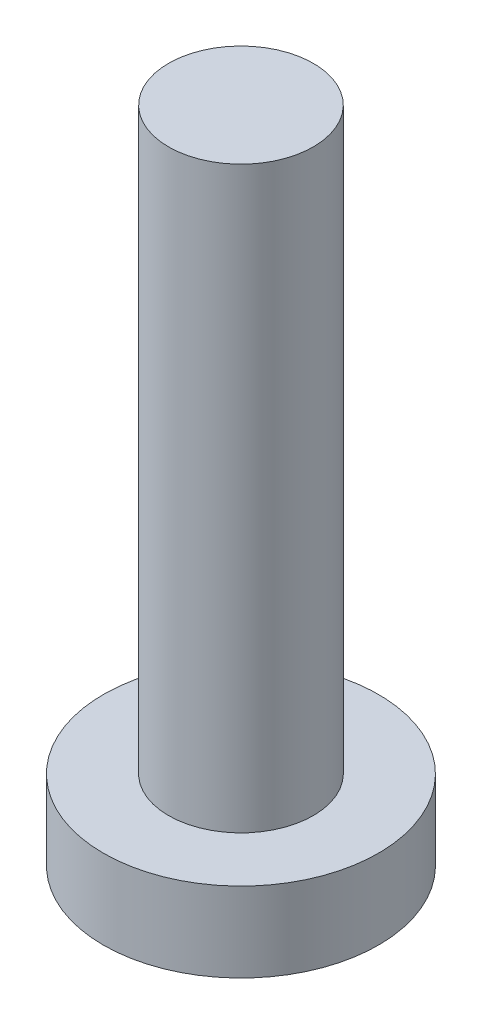
ISO-10303-21;
HEADER;
FILE_DESCRIPTION(('STEP AP214'),'2;1');
FILE_NAME('part.step','',(''),(''),'','','');
FILE_SCHEMA(('AUTOMOTIVE_DESIGN { 1 0 10303 214 1 1 1 1 }'));
ENDSEC;
DATA;
#1=APPLICATION_CONTEXT('core data for automotive mechanical design processes');
#2=APPLICATION_PROTOCOL_DEFINITION('international standard','automotive_design',2000,#1);
#3=PRODUCT_CONTEXT('',#1,'mechanical');
#4=PRODUCT('Part','Part','',(#3));
#5=PRODUCT_RELATED_PRODUCT_CATEGORY('part','',(#4));
#6=PRODUCT_DEFINITION_FORMATION('','',#4);
#7=PRODUCT_DEFINITION_CONTEXT('part definition',#1,'design');
#8=PRODUCT_DEFINITION('design','',#6,#7);
#9=PRODUCT_DEFINITION_SHAPE('','',#8);
#10=(LENGTH_UNIT() NAMED_UNIT(*) SI_UNIT(.MILLI.,.METRE.));
#11=(NAMED_UNIT(*) PLANE_ANGLE_UNIT() SI_UNIT($,.RADIAN.));
#12=(NAMED_UNIT(*) SI_UNIT($,.STERADIAN.) SOLID_ANGLE_UNIT());
#13=UNCERTAINTY_MEASURE_WITH_UNIT(LENGTH_MEASURE(1.E-05),#10,'distance_accuracy_value','');
#14=(GEOMETRIC_REPRESENTATION_CONTEXT(3) GLOBAL_UNCERTAINTY_ASSIGNED_CONTEXT((#13)) GLOBAL_UNIT_ASSIGNED_CONTEXT((#10,
#11,#12)) REPRESENTATION_CONTEXT('',''));
#15=CARTESIAN_POINT('',(0.,0.,0.));
#16=DIRECTION('',(0.,0.,1.));
#17=DIRECTION('',(1.,0.,0.));
#18=AXIS2_PLACEMENT_3D('',#15,#16,#17);
#19=CARTESIAN_POINT('',(0.,1.65,0.));
#20=DIRECTION('',(0.,-1.,0.));
#21=DIRECTION('',(0.,0.,-1.));
#22=AXIS2_PLACEMENT_3D('',#19,#20,#21);
#23=CYLINDRICAL_SURFACE('',#22,2.85);
#24=CARTESIAN_POINT('',(0.,1.65,0.));
#25=DIRECTION('',(0.,1.,0.));
#26=DIRECTION('',(0.,0.,1.));
#27=AXIS2_PLACEMENT_3D('',#24,#25,#26);
#28=CIRCLE('',#27,2.85);
#29=CARTESIAN_POINT('',(0.,1.65,2.85));
#30=VERTEX_POINT('',#29);
#31=EDGE_CURVE('E10',#30,#30,#28,.T.);
#32=ORIENTED_EDGE('',*,*,#31,.F.);
#33=EDGE_LOOP('',(#32));
#34=FACE_BOUND('',#33,.T.);
#35=CARTESIAN_POINT('',(0.,0.,0.));
#36=DIRECTION('',(0.,1.,0.));
#37=DIRECTION('',(0.,0.,1.));
#38=AXIS2_PLACEMENT_3D('',#35,#36,#37);
#39=CIRCLE('',#38,2.85);
#40=CARTESIAN_POINT('',(0.,0.,2.85));
#41=VERTEX_POINT('',#40);
#42=EDGE_CURVE('E36',#41,#41,#39,.T.);
#43=ORIENTED_EDGE('',*,*,#42,.T.);
#44=EDGE_LOOP('',(#43));
#45=FACE_BOUND('',#44,.T.);
#46=ADVANCED_FACE('F33',(#34,#45),#23,.T.);
#47=CARTESIAN_POINT('',(0.,1.65,0.));
#48=DIRECTION('',(0.,1.,0.));
#49=DIRECTION('',(0.,0.,1.));
#50=AXIS2_PLACEMENT_3D('',#47,#48,#49);
#51=PLANE('',#50);
#52=CARTESIAN_POINT('',(0.,1.65,0.));
#53=DIRECTION('',(0.,1.,0.));
#54=DIRECTION('',(0.,0.,1.));
#55=AXIS2_PLACEMENT_3D('',#52,#53,#54);
#56=CIRCLE('',#55,1.5);
#57=CARTESIAN_POINT('',(0.,1.65,1.5));
#58=VERTEX_POINT('',#57);
#59=EDGE_CURVE('E45',#58,#58,#56,.T.);
#60=ORIENTED_EDGE('',*,*,#59,.F.);
#61=EDGE_LOOP('',(#60));
#62=FACE_BOUND('',#61,.T.);
#63=ORIENTED_EDGE('',*,*,#31,.T.);
#64=EDGE_LOOP('',(#63));
#65=FACE_BOUND('',#64,.T.);
#66=ADVANCED_FACE('F60',(#62,#65),#51,.T.);
#67=CARTESIAN_POINT('',(0.,0.,0.));
#68=DIRECTION('',(0.,1.,0.));
#69=DIRECTION('',(0.,0.,1.));
#70=AXIS2_PLACEMENT_3D('',#67,#68,#69);
#71=PLANE('',#70);
#72=ORIENTED_EDGE('',*,*,#42,.F.);
#73=EDGE_LOOP('',(#72));
#74=FACE_BOUND('',#73,.T.);
#75=ADVANCED_FACE('F56',(#74),#71,.F.);
#76=CARTESIAN_POINT('',(0.,13.65,0.));
#77=DIRECTION('',(0.,-1.,0.));
#78=DIRECTION('',(0.,0.,-1.));
#79=AXIS2_PLACEMENT_3D('',#76,#77,#78);
#80=CYLINDRICAL_SURFACE('',#79,1.5);
#81=CARTESIAN_POINT('',(0.,13.65,0.));
#82=DIRECTION('',(0.,1.,0.));
#83=DIRECTION('',(0.,0.,1.));
#84=AXIS2_PLACEMENT_3D('',#81,#82,#83);
#85=CIRCLE('',#84,1.5);
#86=CARTESIAN_POINT('',(0.,13.65,1.5));
#87=VERTEX_POINT('',#86);
#88=EDGE_CURVE('E43',#87,#87,#85,.T.);
#89=ORIENTED_EDGE('',*,*,#88,.F.);
#90=EDGE_LOOP('',(#89));
#91=FACE_BOUND('',#90,.T.);
#92=ORIENTED_EDGE('',*,*,#59,.T.);
#93=EDGE_LOOP('',(#92));
#94=FACE_BOUND('',#93,.T.);
#95=ADVANCED_FACE('F53',(#91,#94),#80,.T.);
#96=CARTESIAN_POINT('',(0.,13.65,0.));
#97=DIRECTION('',(0.,1.,0.));
#98=DIRECTION('',(0.,0.,1.));
#99=AXIS2_PLACEMENT_3D('',#96,#97,#98);
#100=PLANE('',#99);
#101=ORIENTED_EDGE('',*,*,#88,.T.);
#102=EDGE_LOOP('',(#101));
#103=FACE_BOUND('',#102,.T.);
#104=ADVANCED_FACE('F51',(#103),#100,.T.);
#105=CLOSED_SHELL('',(#46,#66,#75,#95,#104));
#106=MANIFOLD_SOLID_BREP('B2',#105);
#107=ADVANCED_BREP_SHAPE_REPRESENTATION('',(#18,#106),#14);
#108=SHAPE_DEFINITION_REPRESENTATION(#9,#107);
ENDSEC;
END-ISO-10303-21;
